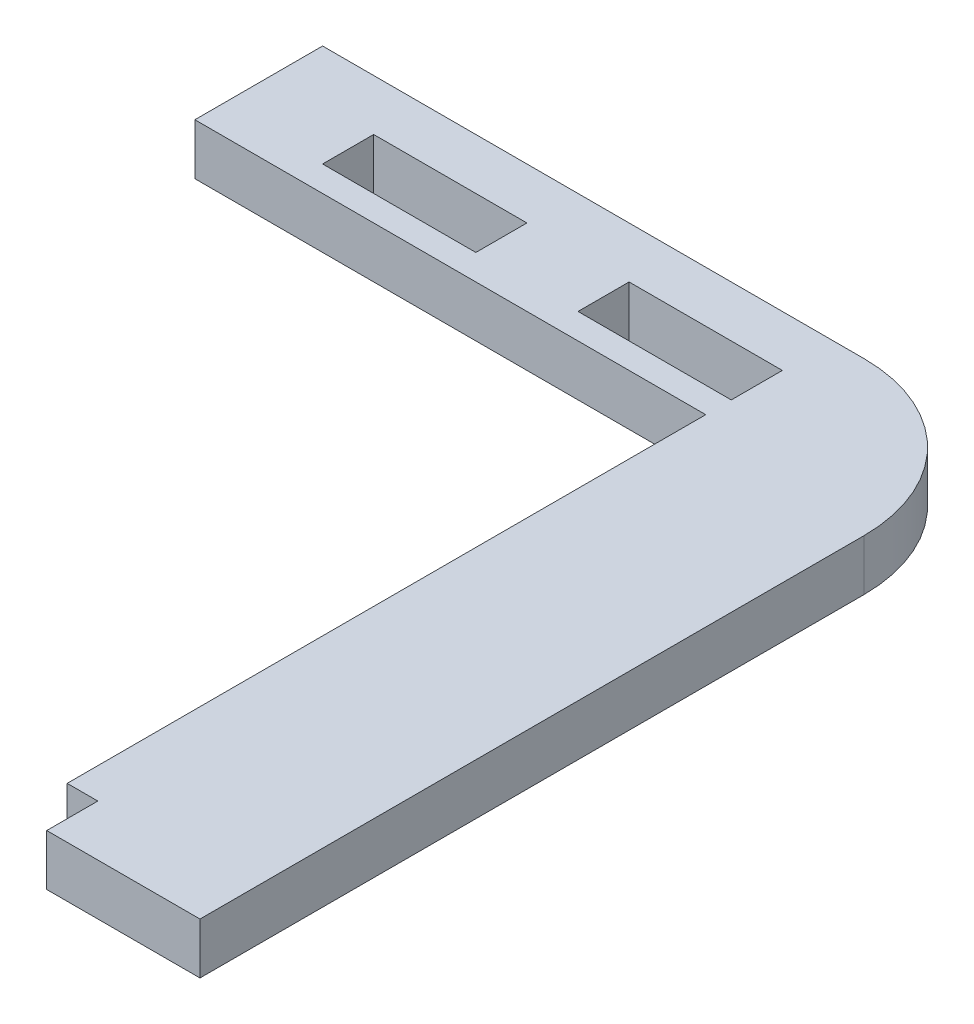
ISO-10303-21;
HEADER;
FILE_DESCRIPTION(('STEP AP214'),'2;1');
FILE_NAME('part.step','',(''),(''),'','','');
FILE_SCHEMA(('AUTOMOTIVE_DESIGN { 1 0 10303 214 1 1 1 1 }'));
ENDSEC;
DATA;
#1=APPLICATION_CONTEXT('core data for automotive mechanical design processes');
#2=APPLICATION_PROTOCOL_DEFINITION('international standard','automotive_design',2000,#1);
#3=PRODUCT_CONTEXT('',#1,'mechanical');
#4=PRODUCT('Part','Part','',(#3));
#5=PRODUCT_RELATED_PRODUCT_CATEGORY('part','',(#4));
#6=PRODUCT_DEFINITION_FORMATION('','',#4);
#7=PRODUCT_DEFINITION_CONTEXT('part definition',#1,'design');
#8=PRODUCT_DEFINITION('design','',#6,#7);
#9=PRODUCT_DEFINITION_SHAPE('','',#8);
#10=(LENGTH_UNIT() NAMED_UNIT(*) SI_UNIT(.MILLI.,.METRE.));
#11=(NAMED_UNIT(*) PLANE_ANGLE_UNIT() SI_UNIT($,.RADIAN.));
#12=(NAMED_UNIT(*) SI_UNIT($,.STERADIAN.) SOLID_ANGLE_UNIT());
#13=UNCERTAINTY_MEASURE_WITH_UNIT(LENGTH_MEASURE(1.E-05),#10,'distance_accuracy_value','');
#14=(GEOMETRIC_REPRESENTATION_CONTEXT(3) GLOBAL_UNCERTAINTY_ASSIGNED_CONTEXT((#13)) GLOBAL_UNIT_ASSIGNED_CONTEXT((#10,
#11,#12)) REPRESENTATION_CONTEXT('',''));
#15=CARTESIAN_POINT('',(0.,0.,0.));
#16=DIRECTION('',(0.,0.,1.));
#17=DIRECTION('',(1.,0.,0.));
#18=AXIS2_PLACEMENT_3D('',#15,#16,#17);
#19=CARTESIAN_POINT('',(0.,5.,0.));
#20=DIRECTION('',(0.,1.,0.));
#21=DIRECTION('',(0.,0.,1.));
#22=AXIS2_PLACEMENT_3D('',#19,#20,#21);
#23=PLANE('',#22);
#24=DIRECTION('',(0.,0.,-1.));
#25=VECTOR('',#24,1.);
#26=CARTESIAN_POINT('',(-19.,5.,-50.));
#27=LINE('',#26,#25);
#28=CARTESIAN_POINT('',(-19.,5.,30.));
#29=VERTEX_POINT('',#28);
#30=CARTESIAN_POINT('',(-19.,5.,-35.));
#31=VERTEX_POINT('',#30);
#32=EDGE_CURVE('E256',#29,#31,#27,.T.);
#33=ORIENTED_EDGE('',*,*,#32,.T.);
#34=CARTESIAN_POINT('',(-34.,5.,-35.));
#35=DIRECTION('',(0.,1.,0.));
#36=DIRECTION('',(0.,0.,1.));
#37=AXIS2_PLACEMENT_3D('',#34,#35,#36);
#38=CIRCLE('',#37,15.);
#39=CARTESIAN_POINT('',(-34.,5.,-50.));
#40=VERTEX_POINT('',#39);
#41=EDGE_CURVE('E11',#31,#40,#38,.T.);
#42=ORIENTED_EDGE('',*,*,#41,.T.);
#43=DIRECTION('',(-1.,0.,0.));
#44=VECTOR('',#43,1.);
#45=CARTESIAN_POINT('',(-19.,5.,-50.));
#46=LINE('',#45,#44);
#47=CARTESIAN_POINT('',(-87.,5.,-50.));
#48=VERTEX_POINT('',#47);
#49=EDGE_CURVE('E259',#40,#48,#46,.T.);
#50=ORIENTED_EDGE('',*,*,#49,.T.);
#51=DIRECTION('',(0.,0.,1.));
#52=VECTOR('',#51,1.);
#53=CARTESIAN_POINT('',(-87.,5.,-50.));
#54=LINE('',#53,#52);
#55=CARTESIAN_POINT('',(-87.,5.,-37.5));
#56=VERTEX_POINT('',#55);
#57=EDGE_CURVE('E263',#48,#56,#54,.T.);
#58=ORIENTED_EDGE('',*,*,#57,.T.);
#59=DIRECTION('',(1.,0.,0.));
#60=VECTOR('',#59,1.);
#61=CARTESIAN_POINT('',(-37.,5.,-37.5));
#62=LINE('',#61,#60);
#63=CARTESIAN_POINT('',(-37.,5.,-37.5));
#64=VERTEX_POINT('',#63);
#65=EDGE_CURVE('E266',#56,#64,#62,.T.);
#66=ORIENTED_EDGE('',*,*,#65,.T.);
#67=DIRECTION('',(0.,0.,1.));
#68=VECTOR('',#67,1.);
#69=CARTESIAN_POINT('',(-37.,5.,25.));
#70=LINE('',#69,#68);
#71=CARTESIAN_POINT('',(-37.,5.,25.));
#72=VERTEX_POINT('',#71);
#73=EDGE_CURVE('E269',#64,#72,#70,.T.);
#74=ORIENTED_EDGE('',*,*,#73,.T.);
#75=DIRECTION('',(1.,0.,0.));
#76=VECTOR('',#75,1.);
#77=CARTESIAN_POINT('',(-34.,5.,25.));
#78=LINE('',#77,#76);
#79=CARTESIAN_POINT('',(-34.,5.,25.));
#80=VERTEX_POINT('',#79);
#81=EDGE_CURVE('E272',#72,#80,#78,.T.);
#82=ORIENTED_EDGE('',*,*,#81,.T.);
#83=DIRECTION('',(0.,0.,1.));
#84=VECTOR('',#83,1.);
#85=CARTESIAN_POINT('',(-34.,5.,25.));
#86=LINE('',#85,#84);
#87=CARTESIAN_POINT('',(-34.,5.,30.));
#88=VERTEX_POINT('',#87);
#89=EDGE_CURVE('E275',#80,#88,#86,.T.);
#90=ORIENTED_EDGE('',*,*,#89,.T.);
#91=DIRECTION('',(1.,0.,0.));
#92=VECTOR('',#91,1.);
#93=CARTESIAN_POINT('',(-34.,5.,30.));
#94=LINE('',#93,#92);
#95=EDGE_CURVE('E278',#88,#29,#94,.T.);
#96=ORIENTED_EDGE('',*,*,#95,.T.);
#97=EDGE_LOOP('',(#33,#42,#50,#58,#66,#74,#82,#90,#96));
#98=FACE_BOUND('',#97,.T.);
#99=DIRECTION('',(1.,0.,0.));
#100=VECTOR('',#99,1.);
#101=CARTESIAN_POINT('',(-52.,5.,-40.));
#102=LINE('',#101,#100);
#103=CARTESIAN_POINT('',(-52.,5.,-40.));
#104=VERTEX_POINT('',#103);
#105=CARTESIAN_POINT('',(-37.,5.,-40.));
#106=VERTEX_POINT('',#105);
#107=EDGE_CURVE('E216',#104,#106,#102,.T.);
#108=ORIENTED_EDGE('',*,*,#107,.F.);
#109=DIRECTION('',(0.,0.,1.));
#110=VECTOR('',#109,1.);
#111=CARTESIAN_POINT('',(-52.,5.,-40.));
#112=LINE('',#111,#110);
#113=CARTESIAN_POINT('',(-52.,5.,-45.));
#114=VERTEX_POINT('',#113);
#115=EDGE_CURVE('E213',#114,#104,#112,.T.);
#116=ORIENTED_EDGE('',*,*,#115,.F.);
#117=DIRECTION('',(-1.,0.,0.));
#118=VECTOR('',#117,1.);
#119=CARTESIAN_POINT('',(-52.,5.,-45.));
#120=LINE('',#119,#118);
#121=CARTESIAN_POINT('',(-37.,5.,-45.));
#122=VERTEX_POINT('',#121);
#123=EDGE_CURVE('E224',#122,#114,#120,.T.);
#124=ORIENTED_EDGE('',*,*,#123,.F.);
#125=DIRECTION('',(0.,0.,-1.));
#126=VECTOR('',#125,1.);
#127=CARTESIAN_POINT('',(-37.,5.,-40.));
#128=LINE('',#127,#126);
#129=EDGE_CURVE('E220',#106,#122,#128,.T.);
#130=ORIENTED_EDGE('',*,*,#129,.F.);
#131=EDGE_LOOP('',(#108,#116,#124,#130));
#132=FACE_BOUND('',#131,.T.);
#133=DIRECTION('',(1.,0.,0.));
#134=VECTOR('',#133,1.);
#135=CARTESIAN_POINT('',(-77.,5.,-40.));
#136=LINE('',#135,#134);
#137=CARTESIAN_POINT('',(-77.,5.,-40.));
#138=VERTEX_POINT('',#137);
#139=CARTESIAN_POINT('',(-62.,5.,-40.));
#140=VERTEX_POINT('',#139);
#141=EDGE_CURVE('E171',#138,#140,#136,.T.);
#142=ORIENTED_EDGE('',*,*,#141,.F.);
#143=DIRECTION('',(0.,0.,1.));
#144=VECTOR('',#143,1.);
#145=CARTESIAN_POINT('',(-77.,5.,-40.));
#146=LINE('',#145,#144);
#147=CARTESIAN_POINT('',(-77.,5.,-45.));
#148=VERTEX_POINT('',#147);
#149=EDGE_CURVE('E160',#148,#138,#146,.T.);
#150=ORIENTED_EDGE('',*,*,#149,.F.);
#151=DIRECTION('',(-1.,0.,0.));
#152=VECTOR('',#151,1.);
#153=CARTESIAN_POINT('',(-77.,5.,-45.));
#154=LINE('',#153,#152);
#155=CARTESIAN_POINT('',(-62.,5.,-45.));
#156=VERTEX_POINT('',#155);
#157=EDGE_CURVE('E189',#156,#148,#154,.T.);
#158=ORIENTED_EDGE('',*,*,#157,.F.);
#159=DIRECTION('',(0.,0.,-1.));
#160=VECTOR('',#159,1.);
#161=CARTESIAN_POINT('',(-62.,5.,-40.));
#162=LINE('',#161,#160);
#163=EDGE_CURVE('E185',#140,#156,#162,.T.);
#164=ORIENTED_EDGE('',*,*,#163,.F.);
#165=EDGE_LOOP('',(#142,#150,#158,#164));
#166=FACE_BOUND('',#165,.T.);
#167=ADVANCED_FACE('F39',(#98,#132,#166),#23,.T.);
#168=CARTESIAN_POINT('',(0.,0.,0.));
#169=DIRECTION('',(0.,1.,0.));
#170=DIRECTION('',(0.,0.,1.));
#171=AXIS2_PLACEMENT_3D('',#168,#169,#170);
#172=PLANE('',#171);
#173=DIRECTION('',(0.,0.,1.));
#174=VECTOR('',#173,1.);
#175=CARTESIAN_POINT('',(-52.,0.,-40.));
#176=LINE('',#175,#174);
#177=CARTESIAN_POINT('',(-52.,0.,-45.));
#178=VERTEX_POINT('',#177);
#179=CARTESIAN_POINT('',(-52.,0.,-40.));
#180=VERTEX_POINT('',#179);
#181=EDGE_CURVE('E180',#178,#180,#176,.T.);
#182=ORIENTED_EDGE('',*,*,#181,.T.);
#183=DIRECTION('',(1.,0.,0.));
#184=VECTOR('',#183,1.);
#185=CARTESIAN_POINT('',(-52.,0.,-40.));
#186=LINE('',#185,#184);
#187=CARTESIAN_POINT('',(-37.,0.,-40.));
#188=VERTEX_POINT('',#187);
#189=EDGE_CURVE('E231',#180,#188,#186,.T.);
#190=ORIENTED_EDGE('',*,*,#189,.T.);
#191=DIRECTION('',(0.,0.,-1.));
#192=VECTOR('',#191,1.);
#193=CARTESIAN_POINT('',(-37.,0.,-40.));
#194=LINE('',#193,#192);
#195=CARTESIAN_POINT('',(-37.,0.,-45.));
#196=VERTEX_POINT('',#195);
#197=EDGE_CURVE('E235',#188,#196,#194,.T.);
#198=ORIENTED_EDGE('',*,*,#197,.T.);
#199=DIRECTION('',(-1.,0.,0.));
#200=VECTOR('',#199,1.);
#201=CARTESIAN_POINT('',(-52.,0.,-45.));
#202=LINE('',#201,#200);
#203=EDGE_CURVE('E217',#196,#178,#202,.T.);
#204=ORIENTED_EDGE('',*,*,#203,.T.);
#205=EDGE_LOOP('',(#182,#190,#198,#204));
#206=FACE_BOUND('',#205,.T.);
#207=DIRECTION('',(-1.,0.,0.));
#208=VECTOR('',#207,1.);
#209=CARTESIAN_POINT('',(-19.,0.,-50.));
#210=LINE('',#209,#208);
#211=CARTESIAN_POINT('',(-34.,0.,-50.));
#212=VERTEX_POINT('',#211);
#213=CARTESIAN_POINT('',(-87.,0.,-50.));
#214=VERTEX_POINT('',#213);
#215=EDGE_CURVE('E284',#212,#214,#210,.T.);
#216=ORIENTED_EDGE('',*,*,#215,.F.);
#217=CARTESIAN_POINT('',(-34.,0.,-35.));
#218=DIRECTION('',(0.,1.,0.));
#219=DIRECTION('',(0.,0.,1.));
#220=AXIS2_PLACEMENT_3D('',#217,#218,#219);
#221=CIRCLE('',#220,15.);
#222=CARTESIAN_POINT('',(-19.,0.,-35.));
#223=VERTEX_POINT('',#222);
#224=EDGE_CURVE('E62',#212,#223,#221,.F.);
#225=ORIENTED_EDGE('',*,*,#224,.T.);
#226=DIRECTION('',(0.,0.,-1.));
#227=VECTOR('',#226,1.);
#228=CARTESIAN_POINT('',(-19.,0.,-50.));
#229=LINE('',#228,#227);
#230=CARTESIAN_POINT('',(-19.,0.,30.));
#231=VERTEX_POINT('',#230);
#232=EDGE_CURVE('E255',#231,#223,#229,.T.);
#233=ORIENTED_EDGE('',*,*,#232,.F.);
#234=DIRECTION('',(1.,0.,0.));
#235=VECTOR('',#234,1.);
#236=CARTESIAN_POINT('',(-34.,0.,30.));
#237=LINE('',#236,#235);
#238=CARTESIAN_POINT('',(-34.,0.,30.));
#239=VERTEX_POINT('',#238);
#240=EDGE_CURVE('E260',#239,#231,#237,.T.);
#241=ORIENTED_EDGE('',*,*,#240,.F.);
#242=DIRECTION('',(0.,0.,1.));
#243=VECTOR('',#242,1.);
#244=CARTESIAN_POINT('',(-34.,0.,25.));
#245=LINE('',#244,#243);
#246=CARTESIAN_POINT('',(-34.,0.,25.));
#247=VERTEX_POINT('',#246);
#248=EDGE_CURVE('E299',#247,#239,#245,.T.);
#249=ORIENTED_EDGE('',*,*,#248,.F.);
#250=DIRECTION('',(1.,0.,0.));
#251=VECTOR('',#250,1.);
#252=CARTESIAN_POINT('',(-34.,0.,25.));
#253=LINE('',#252,#251);
#254=CARTESIAN_POINT('',(-37.,0.,25.));
#255=VERTEX_POINT('',#254);
#256=EDGE_CURVE('E296',#255,#247,#253,.T.);
#257=ORIENTED_EDGE('',*,*,#256,.F.);
#258=DIRECTION('',(0.,0.,1.));
#259=VECTOR('',#258,1.);
#260=CARTESIAN_POINT('',(-37.,0.,25.));
#261=LINE('',#260,#259);
#262=CARTESIAN_POINT('',(-37.,0.,-37.5));
#263=VERTEX_POINT('',#262);
#264=EDGE_CURVE('E293',#263,#255,#261,.T.);
#265=ORIENTED_EDGE('',*,*,#264,.F.);
#266=DIRECTION('',(1.,0.,0.));
#267=VECTOR('',#266,1.);
#268=CARTESIAN_POINT('',(-37.,0.,-37.5));
#269=LINE('',#268,#267);
#270=CARTESIAN_POINT('',(-87.,0.,-37.5));
#271=VERTEX_POINT('',#270);
#272=EDGE_CURVE('E290',#271,#263,#269,.T.);
#273=ORIENTED_EDGE('',*,*,#272,.F.);
#274=DIRECTION('',(0.,0.,1.));
#275=VECTOR('',#274,1.);
#276=CARTESIAN_POINT('',(-87.,0.,-50.));
#277=LINE('',#276,#275);
#278=EDGE_CURVE('E287',#214,#271,#277,.T.);
#279=ORIENTED_EDGE('',*,*,#278,.F.);
#280=EDGE_LOOP('',(#216,#225,#233,#241,#249,#257,#265,#273,#279));
#281=FACE_BOUND('',#280,.T.);
#282=DIRECTION('',(0.,0.,1.));
#283=VECTOR('',#282,1.);
#284=CARTESIAN_POINT('',(-77.,0.,-40.));
#285=LINE('',#284,#283);
#286=CARTESIAN_POINT('',(-77.,0.,-45.));
#287=VERTEX_POINT('',#286);
#288=CARTESIAN_POINT('',(-77.,0.,-40.));
#289=VERTEX_POINT('',#288);
#290=EDGE_CURVE('E194',#287,#289,#285,.T.);
#291=ORIENTED_EDGE('',*,*,#290,.T.);
#292=DIRECTION('',(1.,0.,0.));
#293=VECTOR('',#292,1.);
#294=CARTESIAN_POINT('',(-77.,0.,-40.));
#295=LINE('',#294,#293);
#296=CARTESIAN_POINT('',(-62.,0.,-40.));
#297=VERTEX_POINT('',#296);
#298=EDGE_CURVE('E178',#289,#297,#295,.T.);
#299=ORIENTED_EDGE('',*,*,#298,.T.);
#300=DIRECTION('',(0.,0.,-1.));
#301=VECTOR('',#300,1.);
#302=CARTESIAN_POINT('',(-62.,0.,-40.));
#303=LINE('',#302,#301);
#304=CARTESIAN_POINT('',(-62.,0.,-45.));
#305=VERTEX_POINT('',#304);
#306=EDGE_CURVE('E199',#297,#305,#303,.T.);
#307=ORIENTED_EDGE('',*,*,#306,.T.);
#308=DIRECTION('',(-1.,0.,0.));
#309=VECTOR('',#308,1.);
#310=CARTESIAN_POINT('',(-77.,0.,-45.));
#311=LINE('',#310,#309);
#312=EDGE_CURVE('E172',#305,#287,#311,.T.);
#313=ORIENTED_EDGE('',*,*,#312,.T.);
#314=EDGE_LOOP('',(#291,#299,#307,#313));
#315=FACE_BOUND('',#314,.T.);
#316=ADVANCED_FACE('F345',(#206,#281,#315),#172,.F.);
#317=CARTESIAN_POINT('',(-19.,5.,-50.));
#318=DIRECTION('',(-1.,0.,0.));
#319=DIRECTION('',(0.,0.,1.));
#320=AXIS2_PLACEMENT_3D('',#317,#318,#319);
#321=PLANE('',#320);
#322=ORIENTED_EDGE('',*,*,#232,.T.);
#323=DIRECTION('',(0.,-1.,0.));
#324=VECTOR('',#323,1.);
#325=CARTESIAN_POINT('',(-19.,5.,-35.));
#326=LINE('',#325,#324);
#327=EDGE_CURVE('E48',#223,#31,#326,.F.);
#328=ORIENTED_EDGE('',*,*,#327,.T.);
#329=ORIENTED_EDGE('',*,*,#32,.F.);
#330=DIRECTION('',(0.,-1.,0.));
#331=VECTOR('',#330,1.);
#332=CARTESIAN_POINT('',(-19.,5.,30.));
#333=LINE('',#332,#331);
#334=EDGE_CURVE('E281',#29,#231,#333,.T.);
#335=ORIENTED_EDGE('',*,*,#334,.T.);
#336=EDGE_LOOP('',(#322,#328,#329,#335));
#337=FACE_BOUND('',#336,.T.);
#338=ADVANCED_FACE('F374',(#337),#321,.F.);
#339=CARTESIAN_POINT('',(-19.,5.,-50.));
#340=DIRECTION('',(0.,0.,1.));
#341=DIRECTION('',(1.,0.,0.));
#342=AXIS2_PLACEMENT_3D('',#339,#340,#341);
#343=PLANE('',#342);
#344=ORIENTED_EDGE('',*,*,#49,.F.);
#345=DIRECTION('',(0.,-1.,0.));
#346=VECTOR('',#345,1.);
#347=CARTESIAN_POINT('',(-34.,5.,-50.));
#348=LINE('',#347,#346);
#349=EDGE_CURVE('E331',#40,#212,#348,.T.);
#350=ORIENTED_EDGE('',*,*,#349,.T.);
#351=ORIENTED_EDGE('',*,*,#215,.T.);
#352=DIRECTION('',(0.,-1.,0.));
#353=VECTOR('',#352,1.);
#354=CARTESIAN_POINT('',(-87.,5.,-50.));
#355=LINE('',#354,#353);
#356=EDGE_CURVE('E327',#48,#214,#355,.T.);
#357=ORIENTED_EDGE('',*,*,#356,.F.);
#358=EDGE_LOOP('',(#344,#350,#351,#357));
#359=FACE_BOUND('',#358,.T.);
#360=ADVANCED_FACE('F340',(#359),#343,.F.);
#361=CARTESIAN_POINT('',(-87.,5.,-50.));
#362=DIRECTION('',(1.,0.,0.));
#363=DIRECTION('',(0.,0.,-1.));
#364=AXIS2_PLACEMENT_3D('',#361,#362,#363);
#365=PLANE('',#364);
#366=ORIENTED_EDGE('',*,*,#278,.T.);
#367=DIRECTION('',(0.,-1.,0.));
#368=VECTOR('',#367,1.);
#369=CARTESIAN_POINT('',(-87.,5.,-37.5));
#370=LINE('',#369,#368);
#371=EDGE_CURVE('E323',#56,#271,#370,.T.);
#372=ORIENTED_EDGE('',*,*,#371,.F.);
#373=ORIENTED_EDGE('',*,*,#57,.F.);
#374=ORIENTED_EDGE('',*,*,#356,.T.);
#375=EDGE_LOOP('',(#366,#372,#373,#374));
#376=FACE_BOUND('',#375,.T.);
#377=ADVANCED_FACE('F351',(#376),#365,.F.);
#378=CARTESIAN_POINT('',(-37.,5.,-37.5));
#379=DIRECTION('',(0.,0.,-1.));
#380=DIRECTION('',(-1.,0.,0.));
#381=AXIS2_PLACEMENT_3D('',#378,#379,#380);
#382=PLANE('',#381);
#383=ORIENTED_EDGE('',*,*,#272,.T.);
#384=DIRECTION('',(0.,-1.,0.));
#385=VECTOR('',#384,1.);
#386=CARTESIAN_POINT('',(-37.,5.,-37.5));
#387=LINE('',#386,#385);
#388=EDGE_CURVE('E319',#64,#263,#387,.T.);
#389=ORIENTED_EDGE('',*,*,#388,.F.);
#390=ORIENTED_EDGE('',*,*,#65,.F.);
#391=ORIENTED_EDGE('',*,*,#371,.T.);
#392=EDGE_LOOP('',(#383,#389,#390,#391));
#393=FACE_BOUND('',#392,.T.);
#394=ADVANCED_FACE('F355',(#393),#382,.F.);
#395=CARTESIAN_POINT('',(-37.,5.,25.));
#396=DIRECTION('',(1.,0.,0.));
#397=DIRECTION('',(0.,0.,-1.));
#398=AXIS2_PLACEMENT_3D('',#395,#396,#397);
#399=PLANE('',#398);
#400=ORIENTED_EDGE('',*,*,#264,.T.);
#401=DIRECTION('',(0.,-1.,0.));
#402=VECTOR('',#401,1.);
#403=CARTESIAN_POINT('',(-37.,5.,25.));
#404=LINE('',#403,#402);
#405=EDGE_CURVE('E315',#72,#255,#404,.T.);
#406=ORIENTED_EDGE('',*,*,#405,.F.);
#407=ORIENTED_EDGE('',*,*,#73,.F.);
#408=ORIENTED_EDGE('',*,*,#388,.T.);
#409=EDGE_LOOP('',(#400,#406,#407,#408));
#410=FACE_BOUND('',#409,.T.);
#411=ADVANCED_FACE('F392',(#410),#399,.F.);
#412=CARTESIAN_POINT('',(-34.,5.,25.));
#413=DIRECTION('',(0.,0.,-1.));
#414=DIRECTION('',(-1.,0.,0.));
#415=AXIS2_PLACEMENT_3D('',#412,#413,#414);
#416=PLANE('',#415);
#417=ORIENTED_EDGE('',*,*,#256,.T.);
#418=DIRECTION('',(0.,-1.,0.));
#419=VECTOR('',#418,1.);
#420=CARTESIAN_POINT('',(-34.,5.,25.));
#421=LINE('',#420,#419);
#422=EDGE_CURVE('E311',#80,#247,#421,.T.);
#423=ORIENTED_EDGE('',*,*,#422,.F.);
#424=ORIENTED_EDGE('',*,*,#81,.F.);
#425=ORIENTED_EDGE('',*,*,#405,.T.);
#426=EDGE_LOOP('',(#417,#423,#424,#425));
#427=FACE_BOUND('',#426,.T.);
#428=ADVANCED_FACE('F388',(#427),#416,.F.);
#429=CARTESIAN_POINT('',(-34.,5.,25.));
#430=DIRECTION('',(1.,0.,0.));
#431=DIRECTION('',(0.,0.,-1.));
#432=AXIS2_PLACEMENT_3D('',#429,#430,#431);
#433=PLANE('',#432);
#434=ORIENTED_EDGE('',*,*,#248,.T.);
#435=DIRECTION('',(0.,-1.,0.));
#436=VECTOR('',#435,1.);
#437=CARTESIAN_POINT('',(-34.,5.,30.));
#438=LINE('',#437,#436);
#439=EDGE_CURVE('E307',#88,#239,#438,.T.);
#440=ORIENTED_EDGE('',*,*,#439,.F.);
#441=ORIENTED_EDGE('',*,*,#89,.F.);
#442=ORIENTED_EDGE('',*,*,#422,.T.);
#443=EDGE_LOOP('',(#434,#440,#441,#442));
#444=FACE_BOUND('',#443,.T.);
#445=ADVANCED_FACE('F384',(#444),#433,.F.);
#446=CARTESIAN_POINT('',(-34.,5.,30.));
#447=DIRECTION('',(0.,0.,-1.));
#448=DIRECTION('',(-1.,0.,0.));
#449=AXIS2_PLACEMENT_3D('',#446,#447,#448);
#450=PLANE('',#449);
#451=ORIENTED_EDGE('',*,*,#240,.T.);
#452=ORIENTED_EDGE('',*,*,#334,.F.);
#453=ORIENTED_EDGE('',*,*,#95,.F.);
#454=ORIENTED_EDGE('',*,*,#439,.T.);
#455=EDGE_LOOP('',(#451,#452,#453,#454));
#456=FACE_BOUND('',#455,.T.);
#457=ADVANCED_FACE('F381',(#456),#450,.F.);
#458=CARTESIAN_POINT('',(-52.,5.,-40.));
#459=DIRECTION('',(1.,0.,0.));
#460=DIRECTION('',(0.,0.,-1.));
#461=AXIS2_PLACEMENT_3D('',#458,#459,#460);
#462=PLANE('',#461);
#463=ORIENTED_EDGE('',*,*,#181,.F.);
#464=DIRECTION('',(0.,-1.,0.));
#465=VECTOR('',#464,1.);
#466=CARTESIAN_POINT('',(-52.,5.,-45.));
#467=LINE('',#466,#465);
#468=EDGE_CURVE('E227',#114,#178,#467,.T.);
#469=ORIENTED_EDGE('',*,*,#468,.F.);
#470=ORIENTED_EDGE('',*,*,#115,.T.);
#471=DIRECTION('',(0.,-1.,0.));
#472=VECTOR('',#471,1.);
#473=CARTESIAN_POINT('',(-52.,5.,-40.));
#474=LINE('',#473,#472);
#475=EDGE_CURVE('E251',#104,#180,#474,.T.);
#476=ORIENTED_EDGE('',*,*,#475,.T.);
#477=EDGE_LOOP('',(#463,#469,#470,#476));
#478=FACE_BOUND('',#477,.T.);
#479=ADVANCED_FACE('F378',(#478),#462,.T.);
#480=CARTESIAN_POINT('',(-52.,5.,-40.));
#481=DIRECTION('',(0.,0.,-1.));
#482=DIRECTION('',(-1.,0.,0.));
#483=AXIS2_PLACEMENT_3D('',#480,#481,#482);
#484=PLANE('',#483);
#485=ORIENTED_EDGE('',*,*,#189,.F.);
#486=ORIENTED_EDGE('',*,*,#475,.F.);
#487=ORIENTED_EDGE('',*,*,#107,.T.);
#488=DIRECTION('',(0.,-1.,0.));
#489=VECTOR('',#488,1.);
#490=CARTESIAN_POINT('',(-37.,5.,-40.));
#491=LINE('',#490,#489);
#492=EDGE_CURVE('E248',#106,#188,#491,.T.);
#493=ORIENTED_EDGE('',*,*,#492,.T.);
#494=EDGE_LOOP('',(#485,#486,#487,#493));
#495=FACE_BOUND('',#494,.T.);
#496=ADVANCED_FACE('F450',(#495),#484,.T.);
#497=CARTESIAN_POINT('',(-37.,5.,-40.));
#498=DIRECTION('',(-1.,0.,0.));
#499=DIRECTION('',(0.,0.,1.));
#500=AXIS2_PLACEMENT_3D('',#497,#498,#499);
#501=PLANE('',#500);
#502=ORIENTED_EDGE('',*,*,#197,.F.);
#503=ORIENTED_EDGE('',*,*,#492,.F.);
#504=ORIENTED_EDGE('',*,*,#129,.T.);
#505=DIRECTION('',(0.,-1.,0.));
#506=VECTOR('',#505,1.);
#507=CARTESIAN_POINT('',(-37.,5.,-45.));
#508=LINE('',#507,#506);
#509=EDGE_CURVE('E245',#122,#196,#508,.T.);
#510=ORIENTED_EDGE('',*,*,#509,.T.);
#511=EDGE_LOOP('',(#502,#503,#504,#510));
#512=FACE_BOUND('',#511,.T.);
#513=ADVANCED_FACE('F457',(#512),#501,.T.);
#514=CARTESIAN_POINT('',(-52.,5.,-45.));
#515=DIRECTION('',(0.,0.,1.));
#516=DIRECTION('',(1.,0.,0.));
#517=AXIS2_PLACEMENT_3D('',#514,#515,#516);
#518=PLANE('',#517);
#519=ORIENTED_EDGE('',*,*,#203,.F.);
#520=ORIENTED_EDGE('',*,*,#509,.F.);
#521=ORIENTED_EDGE('',*,*,#123,.T.);
#522=ORIENTED_EDGE('',*,*,#468,.T.);
#523=EDGE_LOOP('',(#519,#520,#521,#522));
#524=FACE_BOUND('',#523,.T.);
#525=ADVANCED_FACE('F464',(#524),#518,.T.);
#526=CARTESIAN_POINT('',(-77.,5.,-40.));
#527=DIRECTION('',(1.,0.,0.));
#528=DIRECTION('',(0.,0.,-1.));
#529=AXIS2_PLACEMENT_3D('',#526,#527,#528);
#530=PLANE('',#529);
#531=ORIENTED_EDGE('',*,*,#290,.F.);
#532=DIRECTION('',(0.,-1.,0.));
#533=VECTOR('',#532,1.);
#534=CARTESIAN_POINT('',(-77.,5.,-45.));
#535=LINE('',#534,#533);
#536=EDGE_CURVE('E166',#148,#287,#535,.T.);
#537=ORIENTED_EDGE('',*,*,#536,.F.);
#538=ORIENTED_EDGE('',*,*,#149,.T.);
#539=DIRECTION('',(0.,-1.,0.));
#540=VECTOR('',#539,1.);
#541=CARTESIAN_POINT('',(-77.,5.,-40.));
#542=LINE('',#541,#540);
#543=EDGE_CURVE('E163',#138,#289,#542,.T.);
#544=ORIENTED_EDGE('',*,*,#543,.T.);
#545=EDGE_LOOP('',(#531,#537,#538,#544));
#546=FACE_BOUND('',#545,.T.);
#547=ADVANCED_FACE('F162',(#546),#530,.T.);
#548=CARTESIAN_POINT('',(-77.,5.,-40.));
#549=DIRECTION('',(0.,0.,-1.));
#550=DIRECTION('',(-1.,0.,0.));
#551=AXIS2_PLACEMENT_3D('',#548,#549,#550);
#552=PLANE('',#551);
#553=ORIENTED_EDGE('',*,*,#298,.F.);
#554=ORIENTED_EDGE('',*,*,#543,.F.);
#555=ORIENTED_EDGE('',*,*,#141,.T.);
#556=DIRECTION('',(0.,-1.,0.));
#557=VECTOR('',#556,1.);
#558=CARTESIAN_POINT('',(-62.,5.,-40.));
#559=LINE('',#558,#557);
#560=EDGE_CURVE('E181',#140,#297,#559,.T.);
#561=ORIENTED_EDGE('',*,*,#560,.T.);
#562=EDGE_LOOP('',(#553,#554,#555,#561));
#563=FACE_BOUND('',#562,.T.);
#564=ADVANCED_FACE('F175',(#563),#552,.T.);
#565=CARTESIAN_POINT('',(-62.,5.,-40.));
#566=DIRECTION('',(-1.,0.,0.));
#567=DIRECTION('',(0.,0.,1.));
#568=AXIS2_PLACEMENT_3D('',#565,#566,#567);
#569=PLANE('',#568);
#570=ORIENTED_EDGE('',*,*,#306,.F.);
#571=ORIENTED_EDGE('',*,*,#560,.F.);
#572=ORIENTED_EDGE('',*,*,#163,.T.);
#573=DIRECTION('',(0.,-1.,0.));
#574=VECTOR('',#573,1.);
#575=CARTESIAN_POINT('',(-62.,5.,-45.));
#576=LINE('',#575,#574);
#577=EDGE_CURVE('E208',#156,#305,#576,.T.);
#578=ORIENTED_EDGE('',*,*,#577,.T.);
#579=EDGE_LOOP('',(#570,#571,#572,#578));
#580=FACE_BOUND('',#579,.T.);
#581=ADVANCED_FACE('F366',(#580),#569,.T.);
#582=CARTESIAN_POINT('',(-77.,5.,-45.));
#583=DIRECTION('',(0.,0.,1.));
#584=DIRECTION('',(1.,0.,0.));
#585=AXIS2_PLACEMENT_3D('',#582,#583,#584);
#586=PLANE('',#585);
#587=ORIENTED_EDGE('',*,*,#312,.F.);
#588=ORIENTED_EDGE('',*,*,#577,.F.);
#589=ORIENTED_EDGE('',*,*,#157,.T.);
#590=ORIENTED_EDGE('',*,*,#536,.T.);
#591=EDGE_LOOP('',(#587,#588,#589,#590));
#592=FACE_BOUND('',#591,.T.);
#593=ADVANCED_FACE('F362',(#592),#586,.T.);
#594=CARTESIAN_POINT('',(-34.,5.,-35.));
#595=DIRECTION('',(0.,-1.,0.));
#596=DIRECTION('',(0.,0.,-1.));
#597=AXIS2_PLACEMENT_3D('',#594,#595,#596);
#598=CYLINDRICAL_SURFACE('',#597,15.);
#599=ORIENTED_EDGE('',*,*,#41,.F.);
#600=ORIENTED_EDGE('',*,*,#327,.F.);
#601=ORIENTED_EDGE('',*,*,#224,.F.);
#602=ORIENTED_EDGE('',*,*,#349,.F.);
#603=EDGE_LOOP('',(#599,#600,#601,#602));
#604=FACE_BOUND('',#603,.T.);
#605=ADVANCED_FACE('F41',(#604),#598,.T.);
#606=CLOSED_SHELL('',(#167,#316,#338,#360,#377,#394,#411,#428,#445,#457,#479,#496,#513,#525,
#547,#564,#581,#593,#605));
#607=MANIFOLD_SOLID_BREP('B2',#606);
#608=ADVANCED_BREP_SHAPE_REPRESENTATION('',(#18,#607),#14);
#609=SHAPE_DEFINITION_REPRESENTATION(#9,#608);
ENDSEC;
END-ISO-10303-21;
